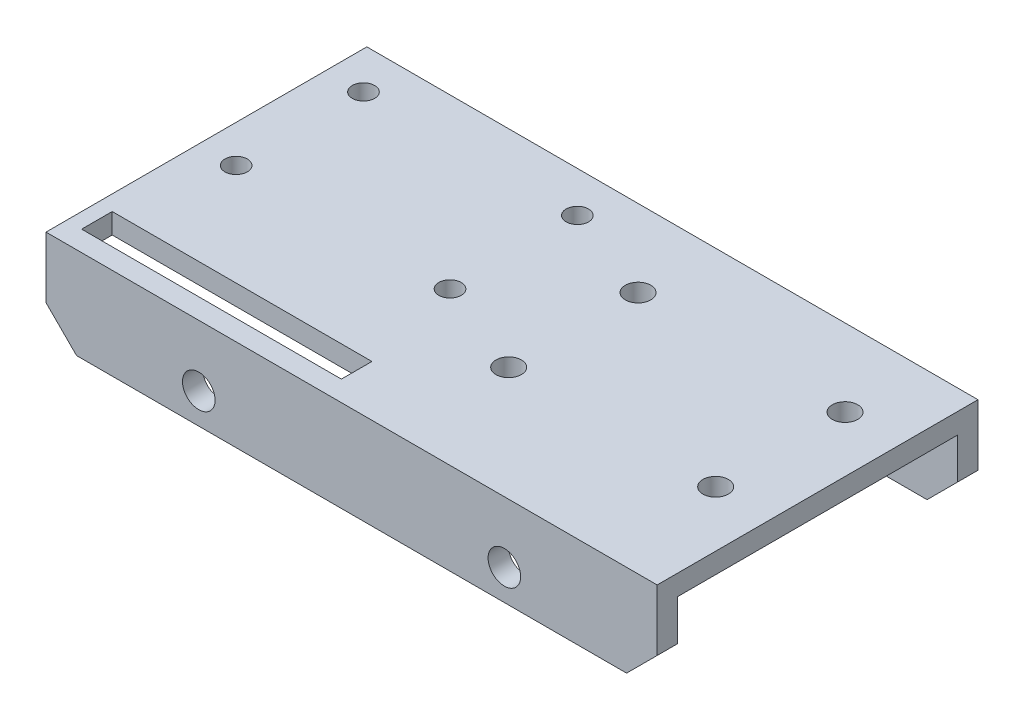
ISO-10303-21;
HEADER;
FILE_DESCRIPTION(('STEP AP214'),'2;1');
FILE_NAME('part.step','',(''),(''),'','','');
FILE_SCHEMA(('AUTOMOTIVE_DESIGN { 1 0 10303 214 1 1 1 1 }'));
ENDSEC;
DATA;
#1=APPLICATION_CONTEXT('core data for automotive mechanical design processes');
#2=APPLICATION_PROTOCOL_DEFINITION('international standard','automotive_design',2000,#1);
#3=PRODUCT_CONTEXT('',#1,'mechanical');
#4=PRODUCT('Part','Part','',(#3));
#5=PRODUCT_RELATED_PRODUCT_CATEGORY('part','',(#4));
#6=PRODUCT_DEFINITION_FORMATION('','',#4);
#7=PRODUCT_DEFINITION_CONTEXT('part definition',#1,'design');
#8=PRODUCT_DEFINITION('design','',#6,#7);
#9=PRODUCT_DEFINITION_SHAPE('','',#8);
#10=(LENGTH_UNIT() NAMED_UNIT(*) SI_UNIT(.MILLI.,.METRE.));
#11=(NAMED_UNIT(*) PLANE_ANGLE_UNIT() SI_UNIT($,.RADIAN.));
#12=(NAMED_UNIT(*) SI_UNIT($,.STERADIAN.) SOLID_ANGLE_UNIT());
#13=UNCERTAINTY_MEASURE_WITH_UNIT(LENGTH_MEASURE(1.E-05),#10,'distance_accuracy_value','');
#14=(GEOMETRIC_REPRESENTATION_CONTEXT(3) GLOBAL_UNCERTAINTY_ASSIGNED_CONTEXT((#13)) GLOBAL_UNIT_ASSIGNED_CONTEXT((#10,
#11,#12)) REPRESENTATION_CONTEXT('',''));
#15=CARTESIAN_POINT('',(0.,0.,0.));
#16=DIRECTION('',(0.,0.,1.));
#17=DIRECTION('',(1.,0.,0.));
#18=AXIS2_PLACEMENT_3D('',#15,#16,#17);
#19=CARTESIAN_POINT('',(0.,0.,0.));
#20=DIRECTION('',(0.,1.,0.));
#21=DIRECTION('',(0.,0.,1.));
#22=AXIS2_PLACEMENT_3D('',#19,#20,#21);
#23=PLANE('',#22);
#24=CARTESIAN_POINT('',(24.525,0.,4.53099999999998));
#25=DIRECTION('',(0.,1.,0.));
#26=DIRECTION('',(0.,0.,1.));
#27=AXIS2_PLACEMENT_3D('',#24,#25,#26);
#28=CIRCLE('',#27,1.25);
#29=CARTESIAN_POINT('',(24.525,0.,5.78099999999998));
#30=VERTEX_POINT('',#29);
#31=EDGE_CURVE('E161',#30,#30,#28,.T.);
#32=ORIENTED_EDGE('',*,*,#31,.T.);
#33=EDGE_LOOP('',(#32));
#34=FACE_BOUND('',#33,.T.);
#35=CARTESIAN_POINT('',(4.20500000000004,0.,4.53099999999998));
#36=DIRECTION('',(0.,1.,0.));
#37=DIRECTION('',(0.,0.,1.));
#38=AXIS2_PLACEMENT_3D('',#35,#36,#37);
#39=CIRCLE('',#38,1.25);
#40=CARTESIAN_POINT('',(4.20500000000004,0.,5.78099999999998));
#41=VERTEX_POINT('',#40);
#42=EDGE_CURVE('E649',#41,#41,#39,.T.);
#43=ORIENTED_EDGE('',*,*,#42,.T.);
#44=EDGE_LOOP('',(#43));
#45=FACE_BOUND('',#44,.T.);
#46=CARTESIAN_POINT('',(4.20500000000004,0.,-8.16900000000002));
#47=DIRECTION('',(0.,1.,0.));
#48=DIRECTION('',(0.,0.,1.));
#49=AXIS2_PLACEMENT_3D('',#46,#47,#48);
#50=CIRCLE('',#49,1.25);
#51=CARTESIAN_POINT('',(4.20500000000004,0.,-6.91900000000002));
#52=VERTEX_POINT('',#51);
#53=EDGE_CURVE('E651',#52,#52,#50,.T.);
#54=ORIENTED_EDGE('',*,*,#53,.T.);
#55=EDGE_LOOP('',(#54));
#56=FACE_BOUND('',#55,.T.);
#57=CARTESIAN_POINT('',(-5.33499999999997,0.,-11.75));
#58=DIRECTION('',(0.,1.,0.));
#59=DIRECTION('',(0.,0.,1.));
#60=AXIS2_PLACEMENT_3D('',#57,#58,#59);
#61=CIRCLE('',#60,1.1);
#62=CARTESIAN_POINT('',(-5.33499999999997,0.,-10.65));
#63=VERTEX_POINT('',#62);
#64=EDGE_CURVE('E656',#63,#63,#61,.T.);
#65=ORIENTED_EDGE('',*,*,#64,.T.);
#66=EDGE_LOOP('',(#65));
#67=FACE_BOUND('',#66,.T.);
#68=CARTESIAN_POINT('',(-5.33499999999998,0.,0.75000000000003));
#69=DIRECTION('',(0.,1.,0.));
#70=DIRECTION('',(0.,0.,1.));
#71=AXIS2_PLACEMENT_3D('',#68,#69,#70);
#72=CIRCLE('',#71,1.1);
#73=CARTESIAN_POINT('',(-5.33499999999998,0.,1.85000000000003));
#74=VERTEX_POINT('',#73);
#75=EDGE_CURVE('E659',#74,#74,#72,.T.);
#76=ORIENTED_EDGE('',*,*,#75,.T.);
#77=EDGE_LOOP('',(#76));
#78=FACE_BOUND('',#77,.T.);
#79=CARTESIAN_POINT('',(-26.335,0.,0.750000000000021));
#80=DIRECTION('',(0.,1.,0.));
#81=DIRECTION('',(0.,0.,1.));
#82=AXIS2_PLACEMENT_3D('',#79,#80,#81);
#83=CIRCLE('',#82,1.1);
#84=CARTESIAN_POINT('',(-26.335,0.,1.85000000000002));
#85=VERTEX_POINT('',#84);
#86=EDGE_CURVE('E662',#85,#85,#83,.T.);
#87=ORIENTED_EDGE('',*,*,#86,.T.);
#88=EDGE_LOOP('',(#87));
#89=FACE_BOUND('',#88,.T.);
#90=CARTESIAN_POINT('',(-26.335,0.,-11.75));
#91=DIRECTION('',(0.,1.,0.));
#92=DIRECTION('',(0.,0.,1.));
#93=AXIS2_PLACEMENT_3D('',#90,#91,#92);
#94=CIRCLE('',#93,1.1);
#95=CARTESIAN_POINT('',(-26.335,0.,-10.65));
#96=VERTEX_POINT('',#95);
#97=EDGE_CURVE('E665',#96,#96,#94,.T.);
#98=ORIENTED_EDGE('',*,*,#97,.T.);
#99=EDGE_LOOP('',(#98));
#100=FACE_BOUND('',#99,.T.);
#101=CARTESIAN_POINT('',(24.525,0.,-8.16900000000002));
#102=DIRECTION('',(0.,1.,0.));
#103=DIRECTION('',(0.,0.,1.));
#104=AXIS2_PLACEMENT_3D('',#101,#102,#103);
#105=CIRCLE('',#104,1.25);
#106=CARTESIAN_POINT('',(24.525,0.,-6.91900000000002));
#107=VERTEX_POINT('',#106);
#108=EDGE_CURVE('E668',#107,#107,#105,.T.);
#109=ORIENTED_EDGE('',*,*,#108,.T.);
#110=EDGE_LOOP('',(#109));
#111=FACE_BOUND('',#110,.T.);
#112=DIRECTION('',(1.,0.,0.));
#113=VECTOR('',#112,1.);
#114=CARTESIAN_POINT('',(-28.5,0.,10.75));
#115=LINE('',#114,#113);
#116=CARTESIAN_POINT('',(-28.5,0.,10.75));
#117=VERTEX_POINT('',#116);
#118=CARTESIAN_POINT('',(-3.,0.,10.75));
#119=VERTEX_POINT('',#118);
#120=EDGE_CURVE('E147',#117,#119,#115,.T.);
#121=ORIENTED_EDGE('',*,*,#120,.F.);
#122=DIRECTION('',(0.,0.,-1.));
#123=VECTOR('',#122,1.);
#124=CARTESIAN_POINT('',(-28.5,0.,13.75));
#125=LINE('',#124,#123);
#126=CARTESIAN_POINT('',(-28.5,0.,13.75));
#127=VERTEX_POINT('',#126);
#128=EDGE_CURVE('E154',#127,#117,#125,.T.);
#129=ORIENTED_EDGE('',*,*,#128,.F.);
#130=DIRECTION('',(1.,0.,0.));
#131=VECTOR('',#130,1.);
#132=CARTESIAN_POINT('',(30.,0.,13.75));
#133=LINE('',#132,#131);
#134=CARTESIAN_POINT('',(-30.,0.,13.75));
#135=VERTEX_POINT('',#134);
#136=EDGE_CURVE('E197',#135,#127,#133,.T.);
#137=ORIENTED_EDGE('',*,*,#136,.F.);
#138=DIRECTION('',(0.,0.,1.));
#139=VECTOR('',#138,1.);
#140=CARTESIAN_POINT('',(-30.,0.,-15.75));
#141=LINE('',#140,#139);
#142=CARTESIAN_POINT('',(-30.,0.,-13.75));
#143=VERTEX_POINT('',#142);
#144=EDGE_CURVE('E224',#143,#135,#141,.T.);
#145=ORIENTED_EDGE('',*,*,#144,.F.);
#146=DIRECTION('',(-1.,0.,0.));
#147=VECTOR('',#146,1.);
#148=CARTESIAN_POINT('',(30.,0.,-13.75));
#149=LINE('',#148,#147);
#150=CARTESIAN_POINT('',(30.,0.,-13.75));
#151=VERTEX_POINT('',#150);
#152=EDGE_CURVE('E206',#151,#143,#149,.T.);
#153=ORIENTED_EDGE('',*,*,#152,.F.);
#154=DIRECTION('',(0.,0.,-1.));
#155=VECTOR('',#154,1.);
#156=CARTESIAN_POINT('',(30.,0.,-15.75));
#157=LINE('',#156,#155);
#158=CARTESIAN_POINT('',(30.,0.,13.75));
#159=VERTEX_POINT('',#158);
#160=EDGE_CURVE('E219',#159,#151,#157,.T.);
#161=ORIENTED_EDGE('',*,*,#160,.F.);
#162=CARTESIAN_POINT('',(-3.,0.,13.75));
#163=VERTEX_POINT('',#162);
#164=EDGE_CURVE('E192',#163,#159,#133,.T.);
#165=ORIENTED_EDGE('',*,*,#164,.F.);
#166=DIRECTION('',(0.,0.,1.));
#167=VECTOR('',#166,1.);
#168=CARTESIAN_POINT('',(-3.,0.,13.75));
#169=LINE('',#168,#167);
#170=EDGE_CURVE('E54',#119,#163,#169,.T.);
#171=ORIENTED_EDGE('',*,*,#170,.F.);
#172=EDGE_LOOP('',(#121,#129,#137,#145,#153,#161,#165,#171));
#173=FACE_BOUND('',#172,.T.);
#174=ADVANCED_FACE('F32',(#34,#45,#56,#67,#78,#89,#100,#111,#173),#23,.F.);
#175=CARTESIAN_POINT('',(30.,2.,-15.75));
#176=DIRECTION('',(-1.,0.,0.));
#177=DIRECTION('',(0.,0.,1.));
#178=AXIS2_PLACEMENT_3D('',#175,#176,#177);
#179=PLANE('',#178);
#180=DIRECTION('',(0.,-1.,0.));
#181=VECTOR('',#180,1.);
#182=CARTESIAN_POINT('',(30.,2.,15.75));
#183=LINE('',#182,#181);
#184=CARTESIAN_POINT('',(30.,2.,15.75));
#185=VERTEX_POINT('',#184);
#186=CARTESIAN_POINT('',(30.,-3.99999999999998,15.75));
#187=VERTEX_POINT('',#186);
#188=EDGE_CURVE('E230',#185,#187,#183,.T.);
#189=ORIENTED_EDGE('',*,*,#188,.T.);
#190=DIRECTION('',(0.,0.,-1.));
#191=VECTOR('',#190,1.);
#192=CARTESIAN_POINT('',(30.,-3.99999999999998,-15.75));
#193=LINE('',#192,#191);
#194=CARTESIAN_POINT('',(30.,-3.99999999999998,13.75));
#195=VERTEX_POINT('',#194);
#196=EDGE_CURVE('E278',#187,#195,#193,.T.);
#197=ORIENTED_EDGE('',*,*,#196,.T.);
#198=DIRECTION('',(0.,1.,0.));
#199=VECTOR('',#198,1.);
#200=CARTESIAN_POINT('',(30.,-7.,13.75));
#201=LINE('',#200,#199);
#202=EDGE_CURVE('E200',#195,#159,#201,.T.);
#203=ORIENTED_EDGE('',*,*,#202,.T.);
#204=ORIENTED_EDGE('',*,*,#160,.T.);
#205=DIRECTION('',(0.,1.,0.));
#206=VECTOR('',#205,1.);
#207=CARTESIAN_POINT('',(30.,-7.,-13.75));
#208=LINE('',#207,#206);
#209=CARTESIAN_POINT('',(30.,-4.,-13.75));
#210=VERTEX_POINT('',#209);
#211=EDGE_CURVE('E217',#210,#151,#208,.T.);
#212=ORIENTED_EDGE('',*,*,#211,.F.);
#213=DIRECTION('',(0.,0.,-1.));
#214=VECTOR('',#213,1.);
#215=CARTESIAN_POINT('',(30.,-4.,-15.75));
#216=LINE('',#215,#214);
#217=CARTESIAN_POINT('',(30.,-4.,-15.75));
#218=VERTEX_POINT('',#217);
#219=EDGE_CURVE('E266',#210,#218,#216,.T.);
#220=ORIENTED_EDGE('',*,*,#219,.T.);
#221=DIRECTION('',(0.,-1.,0.));
#222=VECTOR('',#221,1.);
#223=CARTESIAN_POINT('',(30.,2.,-15.75));
#224=LINE('',#223,#222);
#225=CARTESIAN_POINT('',(30.,2.,-15.75));
#226=VERTEX_POINT('',#225);
#227=EDGE_CURVE('E243',#226,#218,#224,.T.);
#228=ORIENTED_EDGE('',*,*,#227,.F.);
#229=DIRECTION('',(0.,0.,-1.));
#230=VECTOR('',#229,1.);
#231=CARTESIAN_POINT('',(30.,2.,-15.75));
#232=LINE('',#231,#230);
#233=EDGE_CURVE('E220',#185,#226,#232,.T.);
#234=ORIENTED_EDGE('',*,*,#233,.F.);
#235=EDGE_LOOP('',(#189,#197,#203,#204,#212,#220,#228,#234));
#236=FACE_BOUND('',#235,.T.);
#237=ADVANCED_FACE('F308',(#236),#179,.F.);
#238=CARTESIAN_POINT('',(-30.,2.,-15.75));
#239=DIRECTION('',(0.,0.,1.));
#240=DIRECTION('',(1.,0.,0.));
#241=AXIS2_PLACEMENT_3D('',#238,#239,#240);
#242=PLANE('',#241);
#243=CARTESIAN_POINT('',(-15.,-3.99999999999999,-15.75));
#244=DIRECTION('',(0.,0.,1.));
#245=DIRECTION('',(1.,0.,0.));
#246=AXIS2_PLACEMENT_3D('',#243,#244,#245);
#247=CIRCLE('',#246,1.60000000000001);
#248=CARTESIAN_POINT('',(-13.4,-3.99999999999999,-15.75));
#249=VERTEX_POINT('',#248);
#250=EDGE_CURVE('E189',#249,#249,#247,.T.);
#251=ORIENTED_EDGE('',*,*,#250,.T.);
#252=EDGE_LOOP('',(#251));
#253=FACE_BOUND('',#252,.T.);
#254=CARTESIAN_POINT('',(15.,-3.99999999999999,-15.75));
#255=DIRECTION('',(0.,0.,1.));
#256=DIRECTION('',(1.,0.,0.));
#257=AXIS2_PLACEMENT_3D('',#254,#255,#256);
#258=CIRCLE('',#257,1.6);
#259=CARTESIAN_POINT('',(16.6,-3.99999999999999,-15.75));
#260=VERTEX_POINT('',#259);
#261=EDGE_CURVE('E182',#260,#260,#258,.T.);
#262=ORIENTED_EDGE('',*,*,#261,.T.);
#263=EDGE_LOOP('',(#262));
#264=FACE_BOUND('',#263,.T.);
#265=DIRECTION('',(1.,0.,0.));
#266=VECTOR('',#265,1.);
#267=CARTESIAN_POINT('',(30.,-7.,-15.75));
#268=LINE('',#267,#266);
#269=CARTESIAN_POINT('',(-27.,-7.,-15.75));
#270=VERTEX_POINT('',#269);
#271=CARTESIAN_POINT('',(27.,-7.,-15.75));
#272=VERTEX_POINT('',#271);
#273=EDGE_CURVE('E210',#270,#272,#268,.T.);
#274=ORIENTED_EDGE('',*,*,#273,.F.);
#275=DIRECTION('',(-0.707106781186547,0.707106781186549,0.));
#276=VECTOR('',#275,1.);
#277=CARTESIAN_POINT('',(-27.,-7.,-15.75));
#278=LINE('',#277,#276);
#279=CARTESIAN_POINT('',(-30.,-4.,-15.75));
#280=VERTEX_POINT('',#279);
#281=EDGE_CURVE('E258',#270,#280,#278,.T.);
#282=ORIENTED_EDGE('',*,*,#281,.T.);
#283=DIRECTION('',(0.,-1.,0.));
#284=VECTOR('',#283,1.);
#285=CARTESIAN_POINT('',(-30.,2.,-15.75));
#286=LINE('',#285,#284);
#287=CARTESIAN_POINT('',(-30.,2.,-15.75));
#288=VERTEX_POINT('',#287);
#289=EDGE_CURVE('E240',#288,#280,#286,.T.);
#290=ORIENTED_EDGE('',*,*,#289,.F.);
#291=DIRECTION('',(-1.,0.,0.));
#292=VECTOR('',#291,1.);
#293=CARTESIAN_POINT('',(-30.,2.,-15.75));
#294=LINE('',#293,#292);
#295=EDGE_CURVE('E223',#226,#288,#294,.T.);
#296=ORIENTED_EDGE('',*,*,#295,.F.);
#297=ORIENTED_EDGE('',*,*,#227,.T.);
#298=DIRECTION('',(-0.707106781186547,-0.707106781186548,0.));
#299=VECTOR('',#298,1.);
#300=CARTESIAN_POINT('',(27.,-7.,-15.75));
#301=LINE('',#300,#299);
#302=EDGE_CURVE('E256',#218,#272,#301,.T.);
#303=ORIENTED_EDGE('',*,*,#302,.T.);
#304=EDGE_LOOP('',(#274,#282,#290,#296,#297,#303));
#305=FACE_BOUND('',#304,.T.);
#306=ADVANCED_FACE('F314',(#253,#264,#305),#242,.F.);
#307=CARTESIAN_POINT('',(-30.,2.,-15.75));
#308=DIRECTION('',(1.,0.,0.));
#309=DIRECTION('',(0.,0.,-1.));
#310=AXIS2_PLACEMENT_3D('',#307,#308,#309);
#311=PLANE('',#310);
#312=DIRECTION('',(0.,1.,0.));
#313=VECTOR('',#312,1.);
#314=CARTESIAN_POINT('',(-30.,-7.,13.75));
#315=LINE('',#314,#313);
#316=CARTESIAN_POINT('',(-30.,-4.,13.75));
#317=VERTEX_POINT('',#316);
#318=EDGE_CURVE('E204',#317,#135,#315,.T.);
#319=ORIENTED_EDGE('',*,*,#318,.F.);
#320=DIRECTION('',(0.,0.,1.));
#321=VECTOR('',#320,1.);
#322=CARTESIAN_POINT('',(-30.,-4.,-15.75));
#323=LINE('',#322,#321);
#324=CARTESIAN_POINT('',(-30.,-4.,15.75));
#325=VERTEX_POINT('',#324);
#326=EDGE_CURVE('E284',#317,#325,#323,.T.);
#327=ORIENTED_EDGE('',*,*,#326,.T.);
#328=DIRECTION('',(0.,-1.,0.));
#329=VECTOR('',#328,1.);
#330=CARTESIAN_POINT('',(-30.,2.,15.75));
#331=LINE('',#330,#329);
#332=CARTESIAN_POINT('',(-30.,2.,15.75));
#333=VERTEX_POINT('',#332);
#334=EDGE_CURVE('E237',#333,#325,#331,.T.);
#335=ORIENTED_EDGE('',*,*,#334,.F.);
#336=DIRECTION('',(0.,0.,1.));
#337=VECTOR('',#336,1.);
#338=CARTESIAN_POINT('',(-30.,2.,-15.75));
#339=LINE('',#338,#337);
#340=EDGE_CURVE('E226',#288,#333,#339,.T.);
#341=ORIENTED_EDGE('',*,*,#340,.F.);
#342=ORIENTED_EDGE('',*,*,#289,.T.);
#343=DIRECTION('',(0.,0.,1.));
#344=VECTOR('',#343,1.);
#345=CARTESIAN_POINT('',(-30.,-4.,-13.75));
#346=LINE('',#345,#344);
#347=CARTESIAN_POINT('',(-30.,-4.,-13.75));
#348=VERTEX_POINT('',#347);
#349=EDGE_CURVE('E260',#280,#348,#346,.T.);
#350=ORIENTED_EDGE('',*,*,#349,.T.);
#351=DIRECTION('',(0.,1.,0.));
#352=VECTOR('',#351,1.);
#353=CARTESIAN_POINT('',(-30.,-7.,-13.75));
#354=LINE('',#353,#352);
#355=EDGE_CURVE('E213',#348,#143,#354,.T.);
#356=ORIENTED_EDGE('',*,*,#355,.T.);
#357=ORIENTED_EDGE('',*,*,#144,.T.);
#358=EDGE_LOOP('',(#319,#327,#335,#341,#342,#350,#356,#357));
#359=FACE_BOUND('',#358,.T.);
#360=ADVANCED_FACE('F331',(#359),#311,.F.);
#361=CARTESIAN_POINT('',(-30.,2.,15.75));
#362=DIRECTION('',(0.,0.,-1.));
#363=DIRECTION('',(-1.,0.,0.));
#364=AXIS2_PLACEMENT_3D('',#361,#362,#363);
#365=PLANE('',#364);
#366=CARTESIAN_POINT('',(-15.,-3.99999999999999,15.75));
#367=DIRECTION('',(0.,0.,-1.));
#368=DIRECTION('',(-1.,0.,0.));
#369=AXIS2_PLACEMENT_3D('',#366,#367,#368);
#370=CIRCLE('',#369,1.60000000000001);
#371=CARTESIAN_POINT('',(-16.6,-3.99999999999999,15.75));
#372=VERTEX_POINT('',#371);
#373=EDGE_CURVE('E173',#372,#372,#370,.T.);
#374=ORIENTED_EDGE('',*,*,#373,.T.);
#375=EDGE_LOOP('',(#374));
#376=FACE_BOUND('',#375,.T.);
#377=CARTESIAN_POINT('',(15.,-3.99999999999999,15.75));
#378=DIRECTION('',(0.,0.,-1.));
#379=DIRECTION('',(1.,0.,0.));
#380=AXIS2_PLACEMENT_3D('',#377,#378,#379);
#381=CIRCLE('',#380,1.6);
#382=CARTESIAN_POINT('',(16.6,-3.99999999999999,15.75));
#383=VERTEX_POINT('',#382);
#384=EDGE_CURVE('E169',#383,#383,#381,.T.);
#385=ORIENTED_EDGE('',*,*,#384,.T.);
#386=EDGE_LOOP('',(#385));
#387=FACE_BOUND('',#386,.T.);
#388=DIRECTION('',(-1.,0.,0.));
#389=VECTOR('',#388,1.);
#390=CARTESIAN_POINT('',(30.,-7.,15.75));
#391=LINE('',#390,#389);
#392=CARTESIAN_POINT('',(27.,-7.,15.75));
#393=VERTEX_POINT('',#392);
#394=CARTESIAN_POINT('',(-27.,-7.,15.75));
#395=VERTEX_POINT('',#394);
#396=EDGE_CURVE('E193',#393,#395,#391,.T.);
#397=ORIENTED_EDGE('',*,*,#396,.F.);
#398=DIRECTION('',(-0.707106781186547,-0.707106781186548,0.));
#399=VECTOR('',#398,1.);
#400=CARTESIAN_POINT('',(27.,-7.,15.75));
#401=LINE('',#400,#399);
#402=EDGE_CURVE('E276',#393,#187,#401,.F.);
#403=ORIENTED_EDGE('',*,*,#402,.T.);
#404=ORIENTED_EDGE('',*,*,#188,.F.);
#405=DIRECTION('',(1.,0.,0.));
#406=VECTOR('',#405,1.);
#407=CARTESIAN_POINT('',(-30.,2.,15.75));
#408=LINE('',#407,#406);
#409=EDGE_CURVE('E228',#333,#185,#408,.T.);
#410=ORIENTED_EDGE('',*,*,#409,.F.);
#411=ORIENTED_EDGE('',*,*,#334,.T.);
#412=DIRECTION('',(-0.707106781186547,0.707106781186549,0.));
#413=VECTOR('',#412,1.);
#414=CARTESIAN_POINT('',(-27.,-7.,15.75));
#415=LINE('',#414,#413);
#416=EDGE_CURVE('E274',#325,#395,#415,.F.);
#417=ORIENTED_EDGE('',*,*,#416,.T.);
#418=EDGE_LOOP('',(#397,#403,#404,#410,#411,#417));
#419=FACE_BOUND('',#418,.T.);
#420=ADVANCED_FACE('F299',(#376,#387,#419),#365,.F.);
#421=CARTESIAN_POINT('',(0.,2.,0.));
#422=DIRECTION('',(0.,1.,0.));
#423=DIRECTION('',(0.,0.,1.));
#424=AXIS2_PLACEMENT_3D('',#421,#422,#423);
#425=PLANE('',#424);
#426=CARTESIAN_POINT('',(24.525,2.,4.53099999999998));
#427=DIRECTION('',(0.,1.,0.));
#428=DIRECTION('',(0.,0.,1.));
#429=AXIS2_PLACEMENT_3D('',#426,#427,#428);
#430=CIRCLE('',#429,1.25);
#431=CARTESIAN_POINT('',(24.525,2.,5.78099999999998));
#432=VERTEX_POINT('',#431);
#433=EDGE_CURVE('E647',#432,#432,#430,.T.);
#434=ORIENTED_EDGE('',*,*,#433,.F.);
#435=EDGE_LOOP('',(#434));
#436=FACE_BOUND('',#435,.T.);
#437=CARTESIAN_POINT('',(4.20500000000004,2.,4.53099999999998));
#438=DIRECTION('',(0.,1.,0.));
#439=DIRECTION('',(0.,0.,1.));
#440=AXIS2_PLACEMENT_3D('',#437,#438,#439);
#441=CIRCLE('',#440,1.25);
#442=CARTESIAN_POINT('',(4.20500000000004,2.,5.78099999999998));
#443=VERTEX_POINT('',#442);
#444=EDGE_CURVE('E681',#443,#443,#441,.T.);
#445=ORIENTED_EDGE('',*,*,#444,.F.);
#446=EDGE_LOOP('',(#445));
#447=FACE_BOUND('',#446,.T.);
#448=CARTESIAN_POINT('',(4.20500000000004,2.,-8.16900000000002));
#449=DIRECTION('',(0.,1.,0.));
#450=DIRECTION('',(0.,0.,1.));
#451=AXIS2_PLACEMENT_3D('',#448,#449,#450);
#452=CIRCLE('',#451,1.25);
#453=CARTESIAN_POINT('',(4.20500000000004,2.,-6.91900000000002));
#454=VERTEX_POINT('',#453);
#455=EDGE_CURVE('E677',#454,#454,#452,.T.);
#456=ORIENTED_EDGE('',*,*,#455,.F.);
#457=EDGE_LOOP('',(#456));
#458=FACE_BOUND('',#457,.T.);
#459=CARTESIAN_POINT('',(-5.33499999999997,2.,-11.75));
#460=DIRECTION('',(0.,1.,0.));
#461=DIRECTION('',(0.,0.,1.));
#462=AXIS2_PLACEMENT_3D('',#459,#460,#461);
#463=CIRCLE('',#462,1.1);
#464=CARTESIAN_POINT('',(-5.33499999999997,2.,-10.65));
#465=VERTEX_POINT('',#464);
#466=EDGE_CURVE('E674',#465,#465,#463,.T.);
#467=ORIENTED_EDGE('',*,*,#466,.F.);
#468=EDGE_LOOP('',(#467));
#469=FACE_BOUND('',#468,.T.);
#470=CARTESIAN_POINT('',(-5.33499999999998,2.,0.75000000000003));
#471=DIRECTION('',(0.,1.,0.));
#472=DIRECTION('',(0.,0.,1.));
#473=AXIS2_PLACEMENT_3D('',#470,#471,#472);
#474=CIRCLE('',#473,1.1);
#475=CARTESIAN_POINT('',(-5.33499999999998,2.,1.85000000000003));
#476=VERTEX_POINT('',#475);
#477=EDGE_CURVE('E678',#476,#476,#474,.T.);
#478=ORIENTED_EDGE('',*,*,#477,.F.);
#479=EDGE_LOOP('',(#478));
#480=FACE_BOUND('',#479,.T.);
#481=CARTESIAN_POINT('',(-26.335,2.,0.750000000000021));
#482=DIRECTION('',(0.,1.,0.));
#483=DIRECTION('',(0.,0.,1.));
#484=AXIS2_PLACEMENT_3D('',#481,#482,#483);
#485=CIRCLE('',#484,1.1);
#486=CARTESIAN_POINT('',(-26.335,2.,1.85000000000002));
#487=VERTEX_POINT('',#486);
#488=EDGE_CURVE('E688',#487,#487,#485,.T.);
#489=ORIENTED_EDGE('',*,*,#488,.F.);
#490=EDGE_LOOP('',(#489));
#491=FACE_BOUND('',#490,.T.);
#492=CARTESIAN_POINT('',(-26.335,2.,-11.75));
#493=DIRECTION('',(0.,1.,0.));
#494=DIRECTION('',(0.,0.,1.));
#495=AXIS2_PLACEMENT_3D('',#492,#493,#494);
#496=CIRCLE('',#495,1.1);
#497=CARTESIAN_POINT('',(-26.335,2.,-10.65));
#498=VERTEX_POINT('',#497);
#499=EDGE_CURVE('E685',#498,#498,#496,.T.);
#500=ORIENTED_EDGE('',*,*,#499,.F.);
#501=EDGE_LOOP('',(#500));
#502=FACE_BOUND('',#501,.T.);
#503=CARTESIAN_POINT('',(24.525,2.,-8.16900000000002));
#504=DIRECTION('',(0.,1.,0.));
#505=DIRECTION('',(0.,0.,1.));
#506=AXIS2_PLACEMENT_3D('',#503,#504,#505);
#507=CIRCLE('',#506,1.25);
#508=CARTESIAN_POINT('',(24.525,2.,-6.91900000000002));
#509=VERTEX_POINT('',#508);
#510=EDGE_CURVE('E671',#509,#509,#507,.T.);
#511=ORIENTED_EDGE('',*,*,#510,.F.);
#512=EDGE_LOOP('',(#511));
#513=FACE_BOUND('',#512,.T.);
#514=DIRECTION('',(0.,0.,1.));
#515=VECTOR('',#514,1.);
#516=CARTESIAN_POINT('',(-28.5,2.,0.));
#517=LINE('',#516,#515);
#518=CARTESIAN_POINT('',(-28.5,2.,10.75));
#519=VERTEX_POINT('',#518);
#520=CARTESIAN_POINT('',(-28.5,2.,13.75));
#521=VERTEX_POINT('',#520);
#522=EDGE_CURVE('E11',#519,#521,#517,.T.);
#523=ORIENTED_EDGE('',*,*,#522,.F.);
#524=DIRECTION('',(-1.,0.,0.));
#525=VECTOR('',#524,1.);
#526=CARTESIAN_POINT('',(0.,2.,10.75));
#527=LINE('',#526,#525);
#528=CARTESIAN_POINT('',(-3.,2.,10.75));
#529=VERTEX_POINT('',#528);
#530=EDGE_CURVE('E149',#529,#519,#527,.T.);
#531=ORIENTED_EDGE('',*,*,#530,.F.);
#532=DIRECTION('',(0.,0.,-1.));
#533=VECTOR('',#532,1.);
#534=CARTESIAN_POINT('',(-3.,2.,0.));
#535=LINE('',#534,#533);
#536=CARTESIAN_POINT('',(-3.,2.,13.75));
#537=VERTEX_POINT('',#536);
#538=EDGE_CURVE('E287',#537,#529,#535,.T.);
#539=ORIENTED_EDGE('',*,*,#538,.F.);
#540=DIRECTION('',(1.,0.,0.));
#541=VECTOR('',#540,1.);
#542=CARTESIAN_POINT('',(0.,2.,13.75));
#543=LINE('',#542,#541);
#544=EDGE_CURVE('E40',#521,#537,#543,.T.);
#545=ORIENTED_EDGE('',*,*,#544,.F.);
#546=EDGE_LOOP('',(#523,#531,#539,#545));
#547=FACE_BOUND('',#546,.T.);
#548=ORIENTED_EDGE('',*,*,#233,.T.);
#549=ORIENTED_EDGE('',*,*,#295,.T.);
#550=ORIENTED_EDGE('',*,*,#340,.T.);
#551=ORIENTED_EDGE('',*,*,#409,.T.);
#552=EDGE_LOOP('',(#548,#549,#550,#551));
#553=FACE_BOUND('',#552,.T.);
#554=ADVANCED_FACE('F295',(#436,#447,#458,#469,#480,#491,#502,#513,#547,#553),#425,.T.);
#555=CARTESIAN_POINT('',(30.,-7.,-13.75));
#556=DIRECTION('',(0.,0.,-1.));
#557=DIRECTION('',(-1.,0.,0.));
#558=AXIS2_PLACEMENT_3D('',#555,#556,#557);
#559=PLANE('',#558);
#560=CARTESIAN_POINT('',(-15.,-3.99999999999999,-13.75));
#561=DIRECTION('',(0.,0.,-1.));
#562=DIRECTION('',(-1.,0.,0.));
#563=AXIS2_PLACEMENT_3D('',#560,#561,#562);
#564=CIRCLE('',#563,1.60000000000001);
#565=CARTESIAN_POINT('',(-16.6,-3.99999999999999,-13.75));
#566=VERTEX_POINT('',#565);
#567=EDGE_CURVE('E186',#566,#566,#564,.T.);
#568=ORIENTED_EDGE('',*,*,#567,.T.);
#569=EDGE_LOOP('',(#568));
#570=FACE_BOUND('',#569,.T.);
#571=CARTESIAN_POINT('',(15.,-3.99999999999999,-13.75));
#572=DIRECTION('',(0.,0.,-1.));
#573=DIRECTION('',(-1.,0.,0.));
#574=AXIS2_PLACEMENT_3D('',#571,#572,#573);
#575=CIRCLE('',#574,1.6);
#576=CARTESIAN_POINT('',(13.4,-3.99999999999999,-13.75));
#577=VERTEX_POINT('',#576);
#578=EDGE_CURVE('E179',#577,#577,#575,.T.);
#579=ORIENTED_EDGE('',*,*,#578,.T.);
#580=EDGE_LOOP('',(#579));
#581=FACE_BOUND('',#580,.T.);
#582=ORIENTED_EDGE('',*,*,#355,.F.);
#583=DIRECTION('',(0.707106781186547,-0.707106781186549,0.));
#584=VECTOR('',#583,1.);
#585=CARTESIAN_POINT('',(-27.,-7.,-13.75));
#586=LINE('',#585,#584);
#587=CARTESIAN_POINT('',(-27.,-7.,-13.75));
#588=VERTEX_POINT('',#587);
#589=EDGE_CURVE('E264',#348,#588,#586,.T.);
#590=ORIENTED_EDGE('',*,*,#589,.T.);
#591=DIRECTION('',(-1.,0.,0.));
#592=VECTOR('',#591,1.);
#593=CARTESIAN_POINT('',(30.,-7.,-13.75));
#594=LINE('',#593,#592);
#595=CARTESIAN_POINT('',(27.,-7.,-13.75));
#596=VERTEX_POINT('',#595);
#597=EDGE_CURVE('E207',#596,#588,#594,.T.);
#598=ORIENTED_EDGE('',*,*,#597,.F.);
#599=DIRECTION('',(0.707106781186547,0.707106781186548,0.));
#600=VECTOR('',#599,1.);
#601=CARTESIAN_POINT('',(27.,-7.,-13.75));
#602=LINE('',#601,#600);
#603=EDGE_CURVE('E262',#596,#210,#602,.T.);
#604=ORIENTED_EDGE('',*,*,#603,.T.);
#605=ORIENTED_EDGE('',*,*,#211,.T.);
#606=ORIENTED_EDGE('',*,*,#152,.T.);
#607=EDGE_LOOP('',(#582,#590,#598,#604,#605,#606));
#608=FACE_BOUND('',#607,.T.);
#609=ADVANCED_FACE('F298',(#570,#581,#608),#559,.F.);
#610=CARTESIAN_POINT('',(0.,-7.,0.));
#611=DIRECTION('',(0.,-1.,0.));
#612=DIRECTION('',(0.,0.,-1.));
#613=AXIS2_PLACEMENT_3D('',#610,#611,#612);
#614=PLANE('',#613);
#615=ORIENTED_EDGE('',*,*,#597,.T.);
#616=DIRECTION('',(0.,0.,-1.));
#617=VECTOR('',#616,1.);
#618=CARTESIAN_POINT('',(-27.,-7.,-15.75));
#619=LINE('',#618,#617);
#620=EDGE_CURVE('E253',#588,#270,#619,.T.);
#621=ORIENTED_EDGE('',*,*,#620,.T.);
#622=ORIENTED_EDGE('',*,*,#273,.T.);
#623=DIRECTION('',(0.,0.,1.));
#624=VECTOR('',#623,1.);
#625=CARTESIAN_POINT('',(27.,-7.,-13.75));
#626=LINE('',#625,#624);
#627=EDGE_CURVE('E246',#272,#596,#626,.T.);
#628=ORIENTED_EDGE('',*,*,#627,.T.);
#629=EDGE_LOOP('',(#615,#621,#622,#628));
#630=FACE_BOUND('',#629,.T.);
#631=ADVANCED_FACE('F320',(#630),#614,.T.);
#632=CARTESIAN_POINT('',(30.,-7.,13.75));
#633=DIRECTION('',(0.,0.,1.));
#634=DIRECTION('',(1.,0.,0.));
#635=AXIS2_PLACEMENT_3D('',#632,#633,#634);
#636=PLANE('',#635);
#637=CARTESIAN_POINT('',(-15.,-3.99999999999999,13.75));
#638=DIRECTION('',(0.,0.,1.));
#639=DIRECTION('',(1.,0.,0.));
#640=AXIS2_PLACEMENT_3D('',#637,#638,#639);
#641=CIRCLE('',#640,1.60000000000001);
#642=CARTESIAN_POINT('',(-13.4,-3.99999999999999,13.75));
#643=VERTEX_POINT('',#642);
#644=EDGE_CURVE('E185',#643,#643,#641,.T.);
#645=ORIENTED_EDGE('',*,*,#644,.T.);
#646=EDGE_LOOP('',(#645));
#647=FACE_BOUND('',#646,.T.);
#648=CARTESIAN_POINT('',(15.,-3.99999999999999,13.75));
#649=DIRECTION('',(0.,0.,1.));
#650=DIRECTION('',(1.,0.,0.));
#651=AXIS2_PLACEMENT_3D('',#648,#649,#650);
#652=CIRCLE('',#651,1.6);
#653=CARTESIAN_POINT('',(16.6,-3.99999999999999,13.75));
#654=VERTEX_POINT('',#653);
#655=EDGE_CURVE('E176',#654,#654,#652,.T.);
#656=ORIENTED_EDGE('',*,*,#655,.T.);
#657=EDGE_LOOP('',(#656));
#658=FACE_BOUND('',#657,.T.);
#659=ORIENTED_EDGE('',*,*,#202,.F.);
#660=DIRECTION('',(0.707106781186547,0.707106781186548,0.));
#661=VECTOR('',#660,1.);
#662=CARTESIAN_POINT('',(27.,-7.,13.75));
#663=LINE('',#662,#661);
#664=CARTESIAN_POINT('',(27.,-7.,13.75));
#665=VERTEX_POINT('',#664);
#666=EDGE_CURVE('E282',#195,#665,#663,.F.);
#667=ORIENTED_EDGE('',*,*,#666,.T.);
#668=DIRECTION('',(1.,0.,0.));
#669=VECTOR('',#668,1.);
#670=CARTESIAN_POINT('',(30.,-7.,13.75));
#671=LINE('',#670,#669);
#672=CARTESIAN_POINT('',(-27.,-7.,13.75));
#673=VERTEX_POINT('',#672);
#674=EDGE_CURVE('E196',#673,#665,#671,.T.);
#675=ORIENTED_EDGE('',*,*,#674,.F.);
#676=DIRECTION('',(0.707106781186547,-0.707106781186549,0.));
#677=VECTOR('',#676,1.);
#678=CARTESIAN_POINT('',(-27.,-7.,13.75));
#679=LINE('',#678,#677);
#680=EDGE_CURVE('E280',#673,#317,#679,.F.);
#681=ORIENTED_EDGE('',*,*,#680,.T.);
#682=ORIENTED_EDGE('',*,*,#318,.T.);
#683=ORIENTED_EDGE('',*,*,#136,.T.);
#684=DIRECTION('',(0.,-1.,0.));
#685=VECTOR('',#684,1.);
#686=CARTESIAN_POINT('',(-28.5,10.,13.75));
#687=LINE('',#686,#685);
#688=EDGE_CURVE('E157',#521,#127,#687,.T.);
#689=ORIENTED_EDGE('',*,*,#688,.F.);
#690=ORIENTED_EDGE('',*,*,#544,.T.);
#691=DIRECTION('',(0.,-1.,0.));
#692=VECTOR('',#691,1.);
#693=CARTESIAN_POINT('',(-3.,10.,13.75));
#694=LINE('',#693,#692);
#695=EDGE_CURVE('E170',#537,#163,#694,.T.);
#696=ORIENTED_EDGE('',*,*,#695,.T.);
#697=ORIENTED_EDGE('',*,*,#164,.T.);
#698=EDGE_LOOP('',(#659,#667,#675,#681,#682,#683,#689,#690,#696,#697));
#699=FACE_BOUND('',#698,.T.);
#700=ADVANCED_FACE('F291',(#647,#658,#699),#636,.F.);
#701=CARTESIAN_POINT('',(0.,-7.,0.));
#702=DIRECTION('',(0.,1.,0.));
#703=DIRECTION('',(0.,0.,1.));
#704=AXIS2_PLACEMENT_3D('',#701,#702,#703);
#705=PLANE('',#704);
#706=ORIENTED_EDGE('',*,*,#674,.T.);
#707=DIRECTION('',(0.,0.,1.));
#708=VECTOR('',#707,1.);
#709=CARTESIAN_POINT('',(27.,-7.,0.));
#710=LINE('',#709,#708);
#711=EDGE_CURVE('E271',#665,#393,#710,.T.);
#712=ORIENTED_EDGE('',*,*,#711,.T.);
#713=ORIENTED_EDGE('',*,*,#396,.T.);
#714=DIRECTION('',(0.,0.,-1.));
#715=VECTOR('',#714,1.);
#716=CARTESIAN_POINT('',(-27.,-7.,0.));
#717=LINE('',#716,#715);
#718=EDGE_CURVE('E268',#395,#673,#717,.T.);
#719=ORIENTED_EDGE('',*,*,#718,.T.);
#720=EDGE_LOOP('',(#706,#712,#713,#719));
#721=FACE_BOUND('',#720,.T.);
#722=ADVANCED_FACE('F344',(#721),#705,.F.);
#723=CARTESIAN_POINT('',(15.,-3.99999999999999,15.75));
#724=DIRECTION('',(0.,0.,-1.));
#725=DIRECTION('',(-1.,0.,0.));
#726=AXIS2_PLACEMENT_3D('',#723,#724,#725);
#727=CYLINDRICAL_SURFACE('',#726,1.6);
#728=ORIENTED_EDGE('',*,*,#384,.F.);
#729=EDGE_LOOP('',(#728));
#730=FACE_BOUND('',#729,.T.);
#731=ORIENTED_EDGE('',*,*,#655,.F.);
#732=EDGE_LOOP('',(#731));
#733=FACE_BOUND('',#732,.T.);
#734=ADVANCED_FACE('F538',(#730,#733),#727,.F.);
#735=CARTESIAN_POINT('',(-15.,-3.99999999999999,15.75));
#736=DIRECTION('',(0.,0.,-1.));
#737=DIRECTION('',(-1.,0.,0.));
#738=AXIS2_PLACEMENT_3D('',#735,#736,#737);
#739=CYLINDRICAL_SURFACE('',#738,1.60000000000001);
#740=ORIENTED_EDGE('',*,*,#373,.F.);
#741=EDGE_LOOP('',(#740));
#742=FACE_BOUND('',#741,.T.);
#743=ORIENTED_EDGE('',*,*,#644,.F.);
#744=EDGE_LOOP('',(#743));
#745=FACE_BOUND('',#744,.T.);
#746=ADVANCED_FACE('F534',(#742,#745),#739,.F.);
#747=ORIENTED_EDGE('',*,*,#578,.F.);
#748=EDGE_LOOP('',(#747));
#749=FACE_BOUND('',#748,.T.);
#750=ORIENTED_EDGE('',*,*,#261,.F.);
#751=EDGE_LOOP('',(#750));
#752=FACE_BOUND('',#751,.T.);
#753=ADVANCED_FACE('F532',(#749,#752),#727,.F.);
#754=ORIENTED_EDGE('',*,*,#567,.F.);
#755=EDGE_LOOP('',(#754));
#756=FACE_BOUND('',#755,.T.);
#757=ORIENTED_EDGE('',*,*,#250,.F.);
#758=EDGE_LOOP('',(#757));
#759=FACE_BOUND('',#758,.T.);
#760=ADVANCED_FACE('F377',(#756,#759),#739,.F.);
#761=CARTESIAN_POINT('',(-27.,-7.,0.));
#762=DIRECTION('',(-0.707106781186549,-0.707106781186547,0.));
#763=DIRECTION('',(0.,0.,1.));
#764=AXIS2_PLACEMENT_3D('',#761,#762,#763);
#765=PLANE('',#764);
#766=ORIENTED_EDGE('',*,*,#589,.F.);
#767=ORIENTED_EDGE('',*,*,#349,.F.);
#768=ORIENTED_EDGE('',*,*,#281,.F.);
#769=ORIENTED_EDGE('',*,*,#620,.F.);
#770=EDGE_LOOP('',(#766,#767,#768,#769));
#771=FACE_BOUND('',#770,.T.);
#772=ADVANCED_FACE('F327',(#771),#765,.T.);
#773=CARTESIAN_POINT('',(27.,-7.,0.));
#774=DIRECTION('',(0.707106781186548,-0.707106781186547,0.));
#775=DIRECTION('',(0.,0.,-1.));
#776=AXIS2_PLACEMENT_3D('',#773,#774,#775);
#777=PLANE('',#776);
#778=ORIENTED_EDGE('',*,*,#302,.F.);
#779=ORIENTED_EDGE('',*,*,#219,.F.);
#780=ORIENTED_EDGE('',*,*,#603,.F.);
#781=ORIENTED_EDGE('',*,*,#627,.F.);
#782=EDGE_LOOP('',(#778,#779,#780,#781));
#783=FACE_BOUND('',#782,.T.);
#784=ADVANCED_FACE('F317',(#783),#777,.T.);
#785=CARTESIAN_POINT('',(27.,-7.,0.));
#786=DIRECTION('',(-0.707106781186548,0.707106781186547,0.));
#787=DIRECTION('',(0.,0.,1.));
#788=AXIS2_PLACEMENT_3D('',#785,#786,#787);
#789=PLANE('',#788);
#790=ORIENTED_EDGE('',*,*,#666,.F.);
#791=ORIENTED_EDGE('',*,*,#196,.F.);
#792=ORIENTED_EDGE('',*,*,#402,.F.);
#793=ORIENTED_EDGE('',*,*,#711,.F.);
#794=EDGE_LOOP('',(#790,#791,#792,#793));
#795=FACE_BOUND('',#794,.T.);
#796=ADVANCED_FACE('F340',(#795),#789,.F.);
#797=CARTESIAN_POINT('',(-27.,-7.,0.));
#798=DIRECTION('',(0.707106781186549,0.707106781186547,0.));
#799=DIRECTION('',(0.,0.,-1.));
#800=AXIS2_PLACEMENT_3D('',#797,#798,#799);
#801=PLANE('',#800);
#802=ORIENTED_EDGE('',*,*,#416,.F.);
#803=ORIENTED_EDGE('',*,*,#326,.F.);
#804=ORIENTED_EDGE('',*,*,#680,.F.);
#805=ORIENTED_EDGE('',*,*,#718,.F.);
#806=EDGE_LOOP('',(#802,#803,#804,#805));
#807=FACE_BOUND('',#806,.T.);
#808=ADVANCED_FACE('F34',(#807),#801,.F.);
#809=CARTESIAN_POINT('',(-28.5,10.,13.75));
#810=DIRECTION('',(-1.,0.,0.));
#811=DIRECTION('',(0.,0.,1.));
#812=AXIS2_PLACEMENT_3D('',#809,#810,#811);
#813=PLANE('',#812);
#814=ORIENTED_EDGE('',*,*,#522,.T.);
#815=ORIENTED_EDGE('',*,*,#688,.T.);
#816=ORIENTED_EDGE('',*,*,#128,.T.);
#817=DIRECTION('',(0.,-1.,0.));
#818=VECTOR('',#817,1.);
#819=CARTESIAN_POINT('',(-28.5,10.,10.75));
#820=LINE('',#819,#818);
#821=EDGE_CURVE('E143',#519,#117,#820,.T.);
#822=ORIENTED_EDGE('',*,*,#821,.F.);
#823=EDGE_LOOP('',(#814,#815,#816,#822));
#824=FACE_BOUND('',#823,.T.);
#825=ADVANCED_FACE('F155',(#824),#813,.F.);
#826=CARTESIAN_POINT('',(-3.,10.,13.75));
#827=DIRECTION('',(1.,0.,0.));
#828=DIRECTION('',(0.,0.,-1.));
#829=AXIS2_PLACEMENT_3D('',#826,#827,#828);
#830=PLANE('',#829);
#831=ORIENTED_EDGE('',*,*,#538,.T.);
#832=DIRECTION('',(0.,-1.,0.));
#833=VECTOR('',#832,1.);
#834=CARTESIAN_POINT('',(-3.,10.,10.75));
#835=LINE('',#834,#833);
#836=EDGE_CURVE('E47',#529,#119,#835,.T.);
#837=ORIENTED_EDGE('',*,*,#836,.T.);
#838=ORIENTED_EDGE('',*,*,#170,.T.);
#839=ORIENTED_EDGE('',*,*,#695,.F.);
#840=EDGE_LOOP('',(#831,#837,#838,#839));
#841=FACE_BOUND('',#840,.T.);
#842=ADVANCED_FACE('F294',(#841),#830,.F.);
#843=CARTESIAN_POINT('',(-28.5,10.,10.75));
#844=DIRECTION('',(0.,0.,-1.));
#845=DIRECTION('',(-1.,0.,0.));
#846=AXIS2_PLACEMENT_3D('',#843,#844,#845);
#847=PLANE('',#846);
#848=ORIENTED_EDGE('',*,*,#530,.T.);
#849=ORIENTED_EDGE('',*,*,#821,.T.);
#850=ORIENTED_EDGE('',*,*,#120,.T.);
#851=ORIENTED_EDGE('',*,*,#836,.F.);
#852=EDGE_LOOP('',(#848,#849,#850,#851));
#853=FACE_BOUND('',#852,.T.);
#854=ADVANCED_FACE('F145',(#853),#847,.F.);
#855=CARTESIAN_POINT('',(24.525,-8.,-8.16900000000002));
#856=DIRECTION('',(0.,1.,0.));
#857=DIRECTION('',(0.,0.,1.));
#858=AXIS2_PLACEMENT_3D('',#855,#856,#857);
#859=CYLINDRICAL_SURFACE('',#858,1.25);
#860=ORIENTED_EDGE('',*,*,#510,.T.);
#861=EDGE_LOOP('',(#860));
#862=FACE_BOUND('',#861,.T.);
#863=ORIENTED_EDGE('',*,*,#108,.F.);
#864=EDGE_LOOP('',(#863));
#865=FACE_BOUND('',#864,.T.);
#866=ADVANCED_FACE('F431',(#862,#865),#859,.F.);
#867=CARTESIAN_POINT('',(-26.335,-8.,-11.75));
#868=DIRECTION('',(0.,1.,0.));
#869=DIRECTION('',(0.,0.,1.));
#870=AXIS2_PLACEMENT_3D('',#867,#868,#869);
#871=CYLINDRICAL_SURFACE('',#870,1.1);
#872=ORIENTED_EDGE('',*,*,#499,.T.);
#873=EDGE_LOOP('',(#872));
#874=FACE_BOUND('',#873,.T.);
#875=ORIENTED_EDGE('',*,*,#97,.F.);
#876=EDGE_LOOP('',(#875));
#877=FACE_BOUND('',#876,.T.);
#878=ADVANCED_FACE('F454',(#874,#877),#871,.F.);
#879=CARTESIAN_POINT('',(-26.335,-8.,0.750000000000021));
#880=DIRECTION('',(0.,1.,0.));
#881=DIRECTION('',(0.,0.,1.));
#882=AXIS2_PLACEMENT_3D('',#879,#880,#881);
#883=CYLINDRICAL_SURFACE('',#882,1.1);
#884=ORIENTED_EDGE('',*,*,#488,.T.);
#885=EDGE_LOOP('',(#884));
#886=FACE_BOUND('',#885,.T.);
#887=ORIENTED_EDGE('',*,*,#86,.F.);
#888=EDGE_LOOP('',(#887));
#889=FACE_BOUND('',#888,.T.);
#890=ADVANCED_FACE('F464',(#886,#889),#883,.F.);
#891=CARTESIAN_POINT('',(-5.33499999999998,-8.,0.75000000000003));
#892=DIRECTION('',(0.,1.,0.));
#893=DIRECTION('',(0.,0.,1.));
#894=AXIS2_PLACEMENT_3D('',#891,#892,#893);
#895=CYLINDRICAL_SURFACE('',#894,1.1);
#896=ORIENTED_EDGE('',*,*,#477,.T.);
#897=EDGE_LOOP('',(#896));
#898=FACE_BOUND('',#897,.T.);
#899=ORIENTED_EDGE('',*,*,#75,.F.);
#900=EDGE_LOOP('',(#899));
#901=FACE_BOUND('',#900,.T.);
#902=ADVANCED_FACE('F474',(#898,#901),#895,.F.);
#903=CARTESIAN_POINT('',(-5.33499999999997,-8.,-11.75));
#904=DIRECTION('',(0.,1.,0.));
#905=DIRECTION('',(0.,0.,1.));
#906=AXIS2_PLACEMENT_3D('',#903,#904,#905);
#907=CYLINDRICAL_SURFACE('',#906,1.1);
#908=ORIENTED_EDGE('',*,*,#466,.T.);
#909=EDGE_LOOP('',(#908));
#910=FACE_BOUND('',#909,.T.);
#911=ORIENTED_EDGE('',*,*,#64,.F.);
#912=EDGE_LOOP('',(#911));
#913=FACE_BOUND('',#912,.T.);
#914=ADVANCED_FACE('F484',(#910,#913),#907,.F.);
#915=CARTESIAN_POINT('',(4.20500000000004,-8.,-8.16900000000002));
#916=DIRECTION('',(0.,1.,0.));
#917=DIRECTION('',(0.,0.,1.));
#918=AXIS2_PLACEMENT_3D('',#915,#916,#917);
#919=CYLINDRICAL_SURFACE('',#918,1.25);
#920=ORIENTED_EDGE('',*,*,#455,.T.);
#921=EDGE_LOOP('',(#920));
#922=FACE_BOUND('',#921,.T.);
#923=ORIENTED_EDGE('',*,*,#53,.F.);
#924=EDGE_LOOP('',(#923));
#925=FACE_BOUND('',#924,.T.);
#926=ADVANCED_FACE('F494',(#922,#925),#919,.F.);
#927=CARTESIAN_POINT('',(4.20500000000004,-8.,4.53099999999998));
#928=DIRECTION('',(0.,1.,0.));
#929=DIRECTION('',(0.,0.,1.));
#930=AXIS2_PLACEMENT_3D('',#927,#928,#929);
#931=CYLINDRICAL_SURFACE('',#930,1.25);
#932=ORIENTED_EDGE('',*,*,#444,.T.);
#933=EDGE_LOOP('',(#932));
#934=FACE_BOUND('',#933,.T.);
#935=ORIENTED_EDGE('',*,*,#42,.F.);
#936=EDGE_LOOP('',(#935));
#937=FACE_BOUND('',#936,.T.);
#938=ADVANCED_FACE('F504',(#934,#937),#931,.F.);
#939=CARTESIAN_POINT('',(24.525,-8.,4.53099999999998));
#940=DIRECTION('',(0.,1.,0.));
#941=DIRECTION('',(0.,0.,1.));
#942=AXIS2_PLACEMENT_3D('',#939,#940,#941);
#943=CYLINDRICAL_SURFACE('',#942,1.25);
#944=ORIENTED_EDGE('',*,*,#433,.T.);
#945=EDGE_LOOP('',(#944));
#946=FACE_BOUND('',#945,.T.);
#947=ORIENTED_EDGE('',*,*,#31,.F.);
#948=EDGE_LOOP('',(#947));
#949=FACE_BOUND('',#948,.T.);
#950=ADVANCED_FACE('F514',(#946,#949),#943,.F.);
#951=CLOSED_SHELL('',(#174,#237,#306,#360,#420,#554,#609,#631,#700,#722,#734,#746,#753,#760,
#772,#784,#796,#808,#825,#842,#854,#866,#878,#890,#902,#914,#926,#938,#950));
#952=MANIFOLD_SOLID_BREP('B2',#951);
#953=ADVANCED_BREP_SHAPE_REPRESENTATION('',(#18,#952),#14);
#954=SHAPE_DEFINITION_REPRESENTATION(#9,#953);
ENDSEC;
END-ISO-10303-21;
